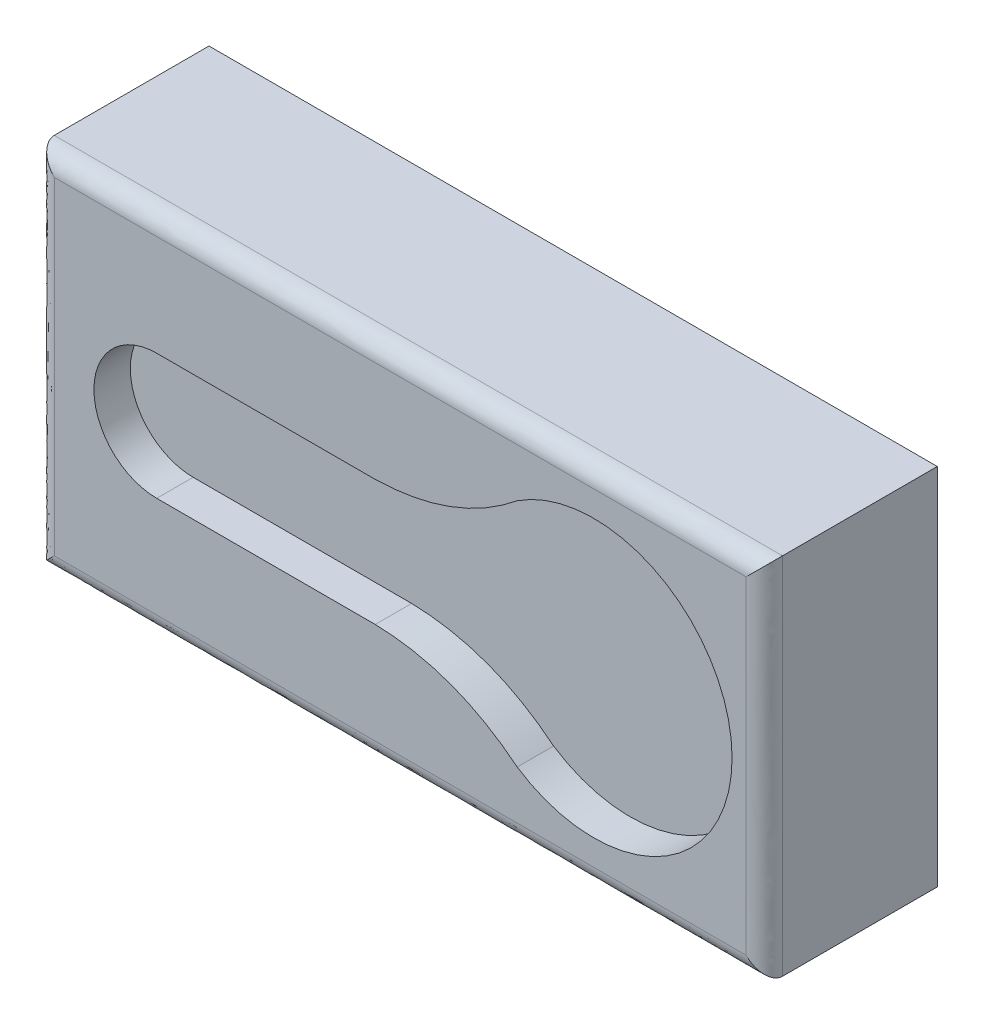
ISO-10303-21;
HEADER;
FILE_DESCRIPTION(('STEP AP214'),'2;1');
FILE_NAME('part.step','',(''),(''),'','','');
FILE_SCHEMA(('AUTOMOTIVE_DESIGN { 1 0 10303 214 1 1 1 1 }'));
ENDSEC;
DATA;
#1=APPLICATION_CONTEXT('core data for automotive mechanical design processes');
#2=APPLICATION_PROTOCOL_DEFINITION('international standard','automotive_design',2000,#1);
#3=PRODUCT_CONTEXT('',#1,'mechanical');
#4=PRODUCT('Part','Part','',(#3));
#5=PRODUCT_RELATED_PRODUCT_CATEGORY('part','',(#4));
#6=PRODUCT_DEFINITION_FORMATION('','',#4);
#7=PRODUCT_DEFINITION_CONTEXT('part definition',#1,'design');
#8=PRODUCT_DEFINITION('design','',#6,#7);
#9=PRODUCT_DEFINITION_SHAPE('','',#8);
#10=(LENGTH_UNIT() NAMED_UNIT(*) SI_UNIT(.MILLI.,.METRE.));
#11=(NAMED_UNIT(*) PLANE_ANGLE_UNIT() SI_UNIT($,.RADIAN.));
#12=(NAMED_UNIT(*) SI_UNIT($,.STERADIAN.) SOLID_ANGLE_UNIT());
#13=UNCERTAINTY_MEASURE_WITH_UNIT(LENGTH_MEASURE(1.E-05),#10,'distance_accuracy_value','');
#14=(GEOMETRIC_REPRESENTATION_CONTEXT(3) GLOBAL_UNCERTAINTY_ASSIGNED_CONTEXT((#13)) GLOBAL_UNIT_ASSIGNED_CONTEXT((#10,
#11,#12)) REPRESENTATION_CONTEXT('',''));
#15=CARTESIAN_POINT('',(0.,0.,0.));
#16=DIRECTION('',(0.,0.,1.));
#17=DIRECTION('',(1.,0.,0.));
#18=AXIS2_PLACEMENT_3D('',#15,#16,#17);
#19=CARTESIAN_POINT('',(-20.,9.99999999999999,-9.5));
#20=DIRECTION('',(1.,0.,0.));
#21=DIRECTION('',(0.,1.,0.));
#22=AXIS2_PLACEMENT_3D('',#19,#20,#21);
#23=PLANE('',#22);
#24=DIRECTION('',(0.,0.,1.));
#25=VECTOR('',#24,1.);
#26=CARTESIAN_POINT('',(-20.,9.99999999999999,-9.5));
#27=LINE('',#26,#25);
#28=CARTESIAN_POINT('',(-20.,9.99999999999999,-9.5));
#29=VERTEX_POINT('',#28);
#30=CARTESIAN_POINT('',(-20.,9.99999999999999,-0.999999999999999));
#31=VERTEX_POINT('',#30);
#32=EDGE_CURVE('E320',#29,#31,#27,.T.);
#33=ORIENTED_EDGE('',*,*,#32,.F.);
#34=DIRECTION('',(0.,-1.,0.));
#35=VECTOR('',#34,1.);
#36=CARTESIAN_POINT('',(-20.,9.99999999999999,-9.5));
#37=LINE('',#36,#35);
#38=CARTESIAN_POINT('',(-20.,-10.,-9.5));
#39=VERTEX_POINT('',#38);
#40=EDGE_CURVE('E302',#29,#39,#37,.T.);
#41=ORIENTED_EDGE('',*,*,#40,.T.);
#42=DIRECTION('',(0.,0.,1.));
#43=VECTOR('',#42,1.);
#44=CARTESIAN_POINT('',(-20.,-10.,-9.5));
#45=LINE('',#44,#43);
#46=CARTESIAN_POINT('',(-20.,-10.,-0.999999999999999));
#47=VERTEX_POINT('',#46);
#48=EDGE_CURVE('E329',#39,#47,#45,.T.);
#49=ORIENTED_EDGE('',*,*,#48,.T.);
#50=CARTESIAN_POINT('',(-20.,50.,-1.));
#51=CARTESIAN_POINT('',(-20.,36.6666666666667,-1.));
#52=CARTESIAN_POINT('',(-20.,23.3333333333333,-1.));
#53=CARTESIAN_POINT('',(-20.,10.,-1.));
#54=CARTESIAN_POINT('',(-20.,3.33333333333333,-1.));
#55=CARTESIAN_POINT('',(-20.,-3.33333333333334,-1.));
#56=CARTESIAN_POINT('',(-20.,-10.,-1.));
#57=CARTESIAN_POINT('',(-20.,-23.3333333333333,-1.));
#58=CARTESIAN_POINT('',(-20.,-36.6666666666667,-1.));
#59=CARTESIAN_POINT('',(-20.,-50.,-1.));
#60=(BOUNDED_CURVE() B_SPLINE_CURVE(3,(#50,#51,#52,#53,#54,#55,#56,#57,#58,#59),.UNSPECIFIED.,
.F.,.F.) B_SPLINE_CURVE_WITH_KNOTS((4,3,3,4),(-0.04,0.,0.02,0.06),
.UNSPECIFIED.) CURVE() GEOMETRIC_REPRESENTATION_ITEM() RATIONAL_B_SPLINE_CURVE((1.,1.,1.,1.,1.,
1.,1.,1.,1.,1.)) REPRESENTATION_ITEM(''));
#61=EDGE_CURVE('E332',#31,#47,#60,.T.);
#62=ORIENTED_EDGE('',*,*,#61,.F.);
#63=EDGE_LOOP('',(#33,#41,#49,#62));
#64=FACE_BOUND('',#63,.T.);
#65=ADVANCED_FACE('F38',(#64),#23,.F.);
#66=CARTESIAN_POINT('',(20.,-10.,-9.5));
#67=DIRECTION('',(0.,1.,0.));
#68=DIRECTION('',(-1.,0.,0.));
#69=AXIS2_PLACEMENT_3D('',#66,#67,#68);
#70=PLANE('',#69);
#71=ORIENTED_EDGE('',*,*,#48,.F.);
#72=DIRECTION('',(1.,0.,0.));
#73=VECTOR('',#72,1.);
#74=CARTESIAN_POINT('',(20.,-10.,-9.5));
#75=LINE('',#74,#73);
#76=CARTESIAN_POINT('',(20.,-10.,-9.5));
#77=VERTEX_POINT('',#76);
#78=EDGE_CURVE('E312',#39,#77,#75,.T.);
#79=ORIENTED_EDGE('',*,*,#78,.T.);
#80=DIRECTION('',(0.,0.,1.));
#81=VECTOR('',#80,1.);
#82=CARTESIAN_POINT('',(20.,-10.,-9.5));
#83=LINE('',#82,#81);
#84=CARTESIAN_POINT('',(20.,-10.,-0.999999999999999));
#85=VERTEX_POINT('',#84);
#86=EDGE_CURVE('E326',#77,#85,#83,.T.);
#87=ORIENTED_EDGE('',*,*,#86,.T.);
#88=CARTESIAN_POINT('',(-100.,-10.,-1.));
#89=CARTESIAN_POINT('',(-73.3333333333333,-10.,-1.));
#90=CARTESIAN_POINT('',(-46.6666666666667,-10.,-1.));
#91=CARTESIAN_POINT('',(-20.,-10.,-1.));
#92=CARTESIAN_POINT('',(-6.66666666666667,-10.,-1.));
#93=CARTESIAN_POINT('',(6.66666666666667,-10.,-1.));
#94=CARTESIAN_POINT('',(20.,-10.,-1.));
#95=CARTESIAN_POINT('',(46.6666666666667,-10.,-1.));
#96=CARTESIAN_POINT('',(73.3333333333334,-9.99999999999999,-1.));
#97=CARTESIAN_POINT('',(100.,-9.99999999999999,-1.));
#98=(BOUNDED_CURVE() B_SPLINE_CURVE(3,(#88,#89,#90,#91,#92,#93,#94,#95,#96,#97),.UNSPECIFIED.,
.F.,.F.) B_SPLINE_CURVE_WITH_KNOTS((4,3,3,4),(-0.12,-0.04,0.,0.08),
.UNSPECIFIED.) CURVE() GEOMETRIC_REPRESENTATION_ITEM() RATIONAL_B_SPLINE_CURVE((1.,1.,1.,1.,1.,
1.,1.,1.,1.,1.)) REPRESENTATION_ITEM(''));
#99=EDGE_CURVE('E367',#47,#85,#98,.T.);
#100=ORIENTED_EDGE('',*,*,#99,.F.);
#101=EDGE_LOOP('',(#71,#79,#87,#100));
#102=FACE_BOUND('',#101,.T.);
#103=ADVANCED_FACE('F194',(#102),#70,.F.);
#104=CARTESIAN_POINT('',(20.,10.,-9.5));
#105=DIRECTION('',(-1.,0.,0.));
#106=DIRECTION('',(0.,-1.,0.));
#107=AXIS2_PLACEMENT_3D('',#104,#105,#106);
#108=PLANE('',#107);
#109=ORIENTED_EDGE('',*,*,#86,.F.);
#110=DIRECTION('',(0.,1.,0.));
#111=VECTOR('',#110,1.);
#112=CARTESIAN_POINT('',(20.,10.,-9.5));
#113=LINE('',#112,#111);
#114=CARTESIAN_POINT('',(20.,10.,-9.5));
#115=VERTEX_POINT('',#114);
#116=EDGE_CURVE('E315',#77,#115,#113,.T.);
#117=ORIENTED_EDGE('',*,*,#116,.T.);
#118=DIRECTION('',(0.,0.,1.));
#119=VECTOR('',#118,1.);
#120=CARTESIAN_POINT('',(20.,10.,-9.5));
#121=LINE('',#120,#119);
#122=CARTESIAN_POINT('',(20.,10.,-0.999999999999999));
#123=VERTEX_POINT('',#122);
#124=EDGE_CURVE('E323',#115,#123,#121,.T.);
#125=ORIENTED_EDGE('',*,*,#124,.T.);
#126=CARTESIAN_POINT('',(20.,-50.,-1.));
#127=CARTESIAN_POINT('',(20.,-36.6666666666667,-1.));
#128=CARTESIAN_POINT('',(20.,-23.3333333333333,-1.));
#129=CARTESIAN_POINT('',(20.,-10.,-1.));
#130=CARTESIAN_POINT('',(20.,-3.33333333333334,-1.));
#131=CARTESIAN_POINT('',(20.,3.33333333333333,-1.));
#132=CARTESIAN_POINT('',(20.,10.,-1.));
#133=CARTESIAN_POINT('',(20.,23.3333333333333,-1.));
#134=CARTESIAN_POINT('',(20.,36.6666666666667,-1.));
#135=CARTESIAN_POINT('',(20.,50.,-1.));
#136=(BOUNDED_CURVE() B_SPLINE_CURVE(3,(#126,#127,#128,#129,#130,#131,#132,#133,#134,#135),
.UNSPECIFIED.,.F.,.F.) B_SPLINE_CURVE_WITH_KNOTS((4,3,3,4),(-0.06,-0.02,0.,0.04),
.UNSPECIFIED.) CURVE() GEOMETRIC_REPRESENTATION_ITEM() RATIONAL_B_SPLINE_CURVE((1.,1.,1.,1.,1.,
1.,1.,1.,1.,1.)) REPRESENTATION_ITEM(''));
#137=EDGE_CURVE('E12',#85,#123,#136,.T.);
#138=ORIENTED_EDGE('',*,*,#137,.F.);
#139=EDGE_LOOP('',(#109,#117,#125,#138));
#140=FACE_BOUND('',#139,.T.);
#141=ADVANCED_FACE('F190',(#140),#108,.F.);
#142=CARTESIAN_POINT('',(20.,10.,-9.5));
#143=DIRECTION('',(0.,-1.,0.));
#144=DIRECTION('',(1.,0.,0.));
#145=AXIS2_PLACEMENT_3D('',#142,#143,#144);
#146=PLANE('',#145);
#147=ORIENTED_EDGE('',*,*,#124,.F.);
#148=DIRECTION('',(-1.,0.,0.));
#149=VECTOR('',#148,1.);
#150=CARTESIAN_POINT('',(20.,10.,-9.5));
#151=LINE('',#150,#149);
#152=EDGE_CURVE('E318',#115,#29,#151,.T.);
#153=ORIENTED_EDGE('',*,*,#152,.T.);
#154=ORIENTED_EDGE('',*,*,#32,.T.);
#155=CARTESIAN_POINT('',(100.,10.,-1.));
#156=CARTESIAN_POINT('',(73.3333333333333,10.,-1.));
#157=CARTESIAN_POINT('',(46.6666666666667,10.,-1.));
#158=CARTESIAN_POINT('',(20.,10.,-1.));
#159=CARTESIAN_POINT('',(6.66666666666668,10.,-1.));
#160=CARTESIAN_POINT('',(-6.66666666666666,10.,-1.));
#161=CARTESIAN_POINT('',(-20.,10.,-1.));
#162=CARTESIAN_POINT('',(-46.6666666666667,9.99999999999999,-1.));
#163=CARTESIAN_POINT('',(-73.3333333333334,9.99999999999999,-1.));
#164=CARTESIAN_POINT('',(-100.,9.99999999999999,-1.));
#165=(BOUNDED_CURVE() B_SPLINE_CURVE(3,(#155,#156,#157,#158,#159,#160,#161,#162,#163,#164),
.UNSPECIFIED.,.F.,.F.) B_SPLINE_CURVE_WITH_KNOTS((4,3,3,4),(-0.08,0.,0.04,0.12),
.UNSPECIFIED.) CURVE() GEOMETRIC_REPRESENTATION_ITEM() RATIONAL_B_SPLINE_CURVE((1.,1.,1.,1.,1.,
1.,1.,1.,1.,1.)) REPRESENTATION_ITEM(''));
#166=EDGE_CURVE('E54',#123,#31,#165,.T.);
#167=ORIENTED_EDGE('',*,*,#166,.F.);
#168=EDGE_LOOP('',(#147,#153,#154,#167));
#169=FACE_BOUND('',#168,.T.);
#170=ADVANCED_FACE('F183',(#169),#146,.F.);
#171=CARTESIAN_POINT('',(0.,0.,-9.5));
#172=DIRECTION('',(0.,0.,1.));
#173=DIRECTION('',(-1.,0.,0.));
#174=AXIS2_PLACEMENT_3D('',#171,#172,#173);
#175=PLANE('',#174);
#176=ORIENTED_EDGE('',*,*,#40,.F.);
#177=ORIENTED_EDGE('',*,*,#152,.F.);
#178=ORIENTED_EDGE('',*,*,#116,.F.);
#179=ORIENTED_EDGE('',*,*,#78,.F.);
#180=EDGE_LOOP('',(#176,#177,#178,#179));
#181=FACE_BOUND('',#180,.T.);
#182=ADVANCED_FACE('F180',(#181),#175,.F.);
#183=CARTESIAN_POINT('',(0.,0.,0.));
#184=DIRECTION('',(0.,0.,1.));
#185=DIRECTION('',(-1.,0.,0.));
#186=AXIS2_PLACEMENT_3D('',#183,#184,#185);
#187=PLANE('',#186);
#188=CARTESIAN_POINT('',(-100.,-9.00000000000002,0.));
#189=CARTESIAN_POINT('',(-73.3333333333333,-9.00000000000002,0.));
#190=CARTESIAN_POINT('',(-46.6666666666667,-9.00000000000001,0.));
#191=CARTESIAN_POINT('',(-20.,-9.00000000000001,0.));
#192=CARTESIAN_POINT('',(-6.66666666666667,-9.00000000000001,0.));
#193=CARTESIAN_POINT('',(6.66666666666667,-9.00000000000001,0.));
#194=CARTESIAN_POINT('',(20.,-9.,0.));
#195=CARTESIAN_POINT('',(46.6666666666667,-9.,0.));
#196=CARTESIAN_POINT('',(73.3333333333334,-9.,0.));
#197=CARTESIAN_POINT('',(100.,-8.99999999999999,0.));
#198=(BOUNDED_CURVE() B_SPLINE_CURVE(3,(#188,#189,#190,#191,#192,#193,#194,#195,#196,#197),
.UNSPECIFIED.,.F.,.F.) B_SPLINE_CURVE_WITH_KNOTS((4,3,3,4),(-0.12,-0.04,0.,0.08),
.UNSPECIFIED.) CURVE() GEOMETRIC_REPRESENTATION_ITEM() RATIONAL_B_SPLINE_CURVE((1.,1.,1.,1.,1.,
1.,1.,1.,1.,1.)) REPRESENTATION_ITEM(''));
#199=CARTESIAN_POINT('',(19.,-9.,0.));
#200=VERTEX_POINT('',#199);
#201=CARTESIAN_POINT('',(-19.,-9.00000000000001,0.));
#202=VERTEX_POINT('',#201);
#203=EDGE_CURVE('E351',#200,#202,#198,.F.);
#204=ORIENTED_EDGE('',*,*,#203,.F.);
#205=CARTESIAN_POINT('',(19.,-50.,0.));
#206=CARTESIAN_POINT('',(19.,-36.6666666666667,0.));
#207=CARTESIAN_POINT('',(19.,-23.3333333333333,0.));
#208=CARTESIAN_POINT('',(19.,-10.,0.));
#209=CARTESIAN_POINT('',(19.,-3.33333333333334,0.));
#210=CARTESIAN_POINT('',(19.,3.33333333333333,0.));
#211=CARTESIAN_POINT('',(19.,10.,0.));
#212=CARTESIAN_POINT('',(19.,23.3333333333333,0.));
#213=CARTESIAN_POINT('',(19.,36.6666666666667,0.));
#214=CARTESIAN_POINT('',(19.,50.,0.));
#215=(BOUNDED_CURVE() B_SPLINE_CURVE(3,(#205,#206,#207,#208,#209,#210,#211,#212,#213,#214),
.UNSPECIFIED.,.F.,.F.) B_SPLINE_CURVE_WITH_KNOTS((4,3,3,4),(-0.06,-0.02,0.,0.04),
.UNSPECIFIED.) CURVE() GEOMETRIC_REPRESENTATION_ITEM() RATIONAL_B_SPLINE_CURVE((1.,1.,1.,1.,1.,
1.,1.,1.,1.,1.)) REPRESENTATION_ITEM(''));
#216=CARTESIAN_POINT('',(19.,9.,0.));
#217=VERTEX_POINT('',#216);
#218=EDGE_CURVE('E337',#217,#200,#215,.F.);
#219=ORIENTED_EDGE('',*,*,#218,.F.);
#220=CARTESIAN_POINT('',(100.,9.00000000000001,0.));
#221=CARTESIAN_POINT('',(73.3333333333333,9.00000000000001,0.));
#222=CARTESIAN_POINT('',(46.6666666666667,9.00000000000001,0.));
#223=CARTESIAN_POINT('',(20.,9.,0.));
#224=CARTESIAN_POINT('',(6.66666666666668,9.,0.));
#225=CARTESIAN_POINT('',(-6.66666666666666,9.,0.));
#226=CARTESIAN_POINT('',(-20.,9.,0.));
#227=CARTESIAN_POINT('',(-46.6666666666667,8.99999999999999,0.));
#228=CARTESIAN_POINT('',(-73.3333333333334,8.99999999999999,0.));
#229=CARTESIAN_POINT('',(-100.,8.99999999999999,0.));
#230=(BOUNDED_CURVE() B_SPLINE_CURVE(3,(#220,#221,#222,#223,#224,#225,#226,#227,#228,#229),
.UNSPECIFIED.,.F.,.F.) B_SPLINE_CURVE_WITH_KNOTS((4,3,3,4),(-0.08,0.,0.04,0.12),
.UNSPECIFIED.) CURVE() GEOMETRIC_REPRESENTATION_ITEM() RATIONAL_B_SPLINE_CURVE((1.,1.,1.,1.,1.,
1.,1.,1.,1.,1.)) REPRESENTATION_ITEM(''));
#231=CARTESIAN_POINT('',(-19.,9.,0.));
#232=VERTEX_POINT('',#231);
#233=EDGE_CURVE('E344',#232,#217,#230,.F.);
#234=ORIENTED_EDGE('',*,*,#233,.F.);
#235=CARTESIAN_POINT('',(-19.,50.,0.));
#236=CARTESIAN_POINT('',(-19.,36.6666666666667,0.));
#237=CARTESIAN_POINT('',(-19.,23.3333333333333,0.));
#238=CARTESIAN_POINT('',(-19.,10.,0.));
#239=CARTESIAN_POINT('',(-19.,3.33333333333333,0.));
#240=CARTESIAN_POINT('',(-19.,-3.33333333333334,0.));
#241=CARTESIAN_POINT('',(-19.,-10.,0.));
#242=CARTESIAN_POINT('',(-19.,-23.3333333333333,0.));
#243=CARTESIAN_POINT('',(-19.,-36.6666666666667,0.));
#244=CARTESIAN_POINT('',(-19.,-50.,0.));
#245=(BOUNDED_CURVE() B_SPLINE_CURVE(3,(#235,#236,#237,#238,#239,#240,#241,#242,#243,#244),
.UNSPECIFIED.,.F.,.F.) B_SPLINE_CURVE_WITH_KNOTS((4,3,3,4),(-0.04,0.,0.02,0.06),
.UNSPECIFIED.) CURVE() GEOMETRIC_REPRESENTATION_ITEM() RATIONAL_B_SPLINE_CURVE((1.,1.,1.,1.,1.,
1.,1.,1.,1.,1.)) REPRESENTATION_ITEM(''));
#246=EDGE_CURVE('E359',#202,#232,#245,.F.);
#247=ORIENTED_EDGE('',*,*,#246,.F.);
#248=EDGE_LOOP('',(#204,#219,#234,#247));
#249=FACE_BOUND('',#248,.T.);
#250=CARTESIAN_POINT('',(6.42660699078059,-6.33271135547255,0.));
#251=CARTESIAN_POINT('',(3.01282740585878,-3.5546753499692,0.));
#252=CARTESIAN_POINT('',(-1.37139742518204,-3.45000000000001,0.));
#253=B_SPLINE_CURVE_WITH_KNOTS('',2,(#250,#251,#252),.UNSPECIFIED.,.F.,.F.,(3,3),(0.,1.),.UNSPECIFIED.);
#254=CARTESIAN_POINT('',(6.4266069907806,-6.33271135547254,0.));
#255=VERTEX_POINT('',#254);
#256=CARTESIAN_POINT('',(-1.37139742518204,-3.45000000000001,0.));
#257=VERTEX_POINT('',#256);
#258=EDGE_CURVE('E280',#255,#257,#253,.T.);
#259=ORIENTED_EDGE('',*,*,#258,.T.);
#260=DIRECTION('',(-1.,0.,0.));
#261=VECTOR('',#260,1.);
#262=CARTESIAN_POINT('',(-13.3713974251821,-3.45000000000001,0.));
#263=LINE('',#262,#261);
#264=CARTESIAN_POINT('',(-13.3713974251821,-3.45000000000001,0.));
#265=VERTEX_POINT('',#264);
#266=EDGE_CURVE('E152',#257,#265,#263,.T.);
#267=ORIENTED_EDGE('',*,*,#266,.T.);
#268=CARTESIAN_POINT('',(-13.3713974251821,0.,0.));
#269=DIRECTION('',(0.,0.,-1.));
#270=DIRECTION('',(-1.,0.,0.));
#271=AXIS2_PLACEMENT_3D('',#268,#269,#270);
#272=CIRCLE('',#271,3.45);
#273=CARTESIAN_POINT('',(-13.3713974251821,3.44999999999999,0.));
#274=VERTEX_POINT('',#273);
#275=EDGE_CURVE('E288',#265,#274,#272,.T.);
#276=ORIENTED_EDGE('',*,*,#275,.T.);
#277=DIRECTION('',(1.,0.,0.));
#278=VECTOR('',#277,1.);
#279=CARTESIAN_POINT('',(-13.3713974251821,3.44999999999999,0.));
#280=LINE('',#279,#278);
#281=CARTESIAN_POINT('',(-1.37139742518204,3.45000000000001,0.));
#282=VERTEX_POINT('',#281);
#283=EDGE_CURVE('E291',#274,#282,#280,.T.);
#284=ORIENTED_EDGE('',*,*,#283,.T.);
#285=CARTESIAN_POINT('',(-1.37139742518204,3.45000000000001,0.));
#286=CARTESIAN_POINT('',(3.01282740585878,3.5546753499692,0.));
#287=CARTESIAN_POINT('',(6.42660699078059,6.33271135547255,0.));
#288=B_SPLINE_CURVE_WITH_KNOTS('',2,(#285,#286,#287),.UNSPECIFIED.,.F.,.F.,(3,3),(0.,1.),.UNSPECIFIED.);
#289=CARTESIAN_POINT('',(6.4266069907806,6.33271135547253,0.));
#290=VERTEX_POINT('',#289);
#291=EDGE_CURVE('E164',#282,#290,#288,.T.);
#292=ORIENTED_EDGE('',*,*,#291,.T.);
#293=CARTESIAN_POINT('',(10.6286025748179,0.,0.));
#294=DIRECTION('',(0.,0.,-1.));
#295=DIRECTION('',(-1.,0.,0.));
#296=AXIS2_PLACEMENT_3D('',#293,#294,#295);
#297=CIRCLE('',#296,7.59999999999999);
#298=EDGE_CURVE('E161',#290,#255,#297,.T.);
#299=ORIENTED_EDGE('',*,*,#298,.T.);
#300=EDGE_LOOP('',(#259,#267,#276,#284,#292,#299));
#301=FACE_BOUND('',#300,.T.);
#302=ADVANCED_FACE('F178',(#249,#301),#187,.T.);
#303=CARTESIAN_POINT('',(6.42660699078059,-6.33271135547255,-2.));
#304=CARTESIAN_POINT('',(3.01282740585878,-3.5546753499692,-2.));
#305=CARTESIAN_POINT('',(-1.37139742518204,-3.45000000000001,-2.));
#306=B_SPLINE_CURVE_WITH_KNOTS('',2,(#303,#304,#305),.UNSPECIFIED.,.F.,.F.,(3,3),(0.,1.),.UNSPECIFIED.);
#307=DIRECTION('',(0.,0.,1.));
#308=VECTOR('',#307,1.);
#309=SURFACE_OF_LINEAR_EXTRUSION('',#306,#308);
#310=ORIENTED_EDGE('',*,*,#258,.F.);
#311=DIRECTION('',(0.,0.,1.));
#312=VECTOR('',#311,1.);
#313=CARTESIAN_POINT('',(6.4266069907806,-6.33271135547254,-2.));
#314=LINE('',#313,#312);
#315=CARTESIAN_POINT('',(6.4266069907806,-6.33271135547254,-2.));
#316=VERTEX_POINT('',#315);
#317=EDGE_CURVE('E160',#316,#255,#314,.T.);
#318=ORIENTED_EDGE('',*,*,#317,.F.);
#319=CARTESIAN_POINT('',(-1.37139742518204,-3.45000000000001,-2.));
#320=VERTEX_POINT('',#319);
#321=EDGE_CURVE('E141',#316,#320,#306,.T.);
#322=ORIENTED_EDGE('',*,*,#321,.T.);
#323=DIRECTION('',(0.,0.,1.));
#324=VECTOR('',#323,1.);
#325=CARTESIAN_POINT('',(-1.37139742518204,-3.45000000000001,-2.));
#326=LINE('',#325,#324);
#327=EDGE_CURVE('E149',#320,#257,#326,.T.);
#328=ORIENTED_EDGE('',*,*,#327,.T.);
#329=EDGE_LOOP('',(#310,#318,#322,#328));
#330=FACE_BOUND('',#329,.T.);
#331=ADVANCED_FACE('F159',(#330),#309,.T.);
#332=CARTESIAN_POINT('',(10.6286025748179,0.,-2.));
#333=DIRECTION('',(0.,0.,1.));
#334=DIRECTION('',(-1.,0.,0.));
#335=AXIS2_PLACEMENT_3D('',#332,#333,#334);
#336=CYLINDRICAL_SURFACE('',#335,7.59999999999999);
#337=ORIENTED_EDGE('',*,*,#298,.F.);
#338=DIRECTION('',(0.,0.,1.));
#339=VECTOR('',#338,1.);
#340=CARTESIAN_POINT('',(6.4266069907806,6.33271135547253,-2.));
#341=LINE('',#340,#339);
#342=CARTESIAN_POINT('',(6.4266069907806,6.33271135547253,-2.));
#343=VERTEX_POINT('',#342);
#344=EDGE_CURVE('E303',#343,#290,#341,.T.);
#345=ORIENTED_EDGE('',*,*,#344,.F.);
#346=CARTESIAN_POINT('',(10.6286025748179,0.,-2.));
#347=DIRECTION('',(0.,0.,-1.));
#348=DIRECTION('',(-1.,0.,0.));
#349=AXIS2_PLACEMENT_3D('',#346,#347,#348);
#350=CIRCLE('',#349,7.59999999999999);
#351=EDGE_CURVE('E157',#343,#316,#350,.T.);
#352=ORIENTED_EDGE('',*,*,#351,.T.);
#353=ORIENTED_EDGE('',*,*,#317,.T.);
#354=EDGE_LOOP('',(#337,#345,#352,#353));
#355=FACE_BOUND('',#354,.T.);
#356=ADVANCED_FACE('F177',(#355),#336,.F.);
#357=CARTESIAN_POINT('',(-1.37139742518204,3.45000000000001,-2.));
#358=CARTESIAN_POINT('',(3.01282740585878,3.5546753499692,-2.));
#359=CARTESIAN_POINT('',(6.42660699078059,6.33271135547255,-2.));
#360=B_SPLINE_CURVE_WITH_KNOTS('',2,(#357,#358,#359),.UNSPECIFIED.,.F.,.F.,(3,3),(0.,1.),.UNSPECIFIED.);
#361=DIRECTION('',(0.,0.,1.));
#362=VECTOR('',#361,1.);
#363=SURFACE_OF_LINEAR_EXTRUSION('',#360,#362);
#364=ORIENTED_EDGE('',*,*,#291,.F.);
#365=DIRECTION('',(0.,0.,1.));
#366=VECTOR('',#365,1.);
#367=CARTESIAN_POINT('',(-1.37139742518204,3.45000000000001,-2.));
#368=LINE('',#367,#366);
#369=CARTESIAN_POINT('',(-1.37139742518204,3.45000000000001,-2.));
#370=VERTEX_POINT('',#369);
#371=EDGE_CURVE('E305',#370,#282,#368,.T.);
#372=ORIENTED_EDGE('',*,*,#371,.F.);
#373=EDGE_CURVE('E269',#370,#343,#360,.T.);
#374=ORIENTED_EDGE('',*,*,#373,.T.);
#375=ORIENTED_EDGE('',*,*,#344,.T.);
#376=EDGE_LOOP('',(#364,#372,#374,#375));
#377=FACE_BOUND('',#376,.T.);
#378=ADVANCED_FACE('F262',(#377),#363,.T.);
#379=CARTESIAN_POINT('',(-13.3713974251821,3.44999999999999,-2.));
#380=DIRECTION('',(0.,1.,0.));
#381=DIRECTION('',(0.,0.,-1.));
#382=AXIS2_PLACEMENT_3D('',#379,#380,#381);
#383=PLANE('',#382);
#384=ORIENTED_EDGE('',*,*,#283,.F.);
#385=DIRECTION('',(0.,0.,1.));
#386=VECTOR('',#385,1.);
#387=CARTESIAN_POINT('',(-13.3713974251821,3.44999999999999,-2.));
#388=LINE('',#387,#386);
#389=CARTESIAN_POINT('',(-13.3713974251821,3.44999999999999,-2.));
#390=VERTEX_POINT('',#389);
#391=EDGE_CURVE('E307',#390,#274,#388,.T.);
#392=ORIENTED_EDGE('',*,*,#391,.F.);
#393=DIRECTION('',(1.,0.,0.));
#394=VECTOR('',#393,1.);
#395=CARTESIAN_POINT('',(-13.3713974251821,3.44999999999999,-2.));
#396=LINE('',#395,#394);
#397=EDGE_CURVE('E275',#390,#370,#396,.T.);
#398=ORIENTED_EDGE('',*,*,#397,.T.);
#399=ORIENTED_EDGE('',*,*,#371,.T.);
#400=EDGE_LOOP('',(#384,#392,#398,#399));
#401=FACE_BOUND('',#400,.T.);
#402=ADVANCED_FACE('F267',(#401),#383,.F.);
#403=CARTESIAN_POINT('',(-13.3713974251821,0.,-2.));
#404=DIRECTION('',(0.,0.,1.));
#405=DIRECTION('',(-1.,0.,0.));
#406=AXIS2_PLACEMENT_3D('',#403,#404,#405);
#407=CYLINDRICAL_SURFACE('',#406,3.45);
#408=ORIENTED_EDGE('',*,*,#275,.F.);
#409=DIRECTION('',(0.,0.,1.));
#410=VECTOR('',#409,1.);
#411=CARTESIAN_POINT('',(-13.3713974251821,-3.45000000000001,-2.));
#412=LINE('',#411,#410);
#413=CARTESIAN_POINT('',(-13.3713974251821,-3.45000000000001,-2.));
#414=VERTEX_POINT('',#413);
#415=EDGE_CURVE('E156',#414,#265,#412,.T.);
#416=ORIENTED_EDGE('',*,*,#415,.F.);
#417=CARTESIAN_POINT('',(-13.3713974251821,0.,-2.));
#418=DIRECTION('',(0.,0.,-1.));
#419=DIRECTION('',(-1.,0.,0.));
#420=AXIS2_PLACEMENT_3D('',#417,#418,#419);
#421=CIRCLE('',#420,3.45);
#422=EDGE_CURVE('E144',#414,#390,#421,.T.);
#423=ORIENTED_EDGE('',*,*,#422,.T.);
#424=ORIENTED_EDGE('',*,*,#391,.T.);
#425=EDGE_LOOP('',(#408,#416,#423,#424));
#426=FACE_BOUND('',#425,.T.);
#427=ADVANCED_FACE('F258',(#426),#407,.F.);
#428=CARTESIAN_POINT('',(-13.3713974251821,-3.45000000000001,-2.));
#429=DIRECTION('',(0.,-1.,0.));
#430=DIRECTION('',(0.,0.,1.));
#431=AXIS2_PLACEMENT_3D('',#428,#429,#430);
#432=PLANE('',#431);
#433=ORIENTED_EDGE('',*,*,#266,.F.);
#434=ORIENTED_EDGE('',*,*,#327,.F.);
#435=DIRECTION('',(-1.,0.,0.));
#436=VECTOR('',#435,1.);
#437=CARTESIAN_POINT('',(-13.3713974251821,-3.45000000000001,-2.));
#438=LINE('',#437,#436);
#439=EDGE_CURVE('E136',#320,#414,#438,.T.);
#440=ORIENTED_EDGE('',*,*,#439,.T.);
#441=ORIENTED_EDGE('',*,*,#415,.T.);
#442=EDGE_LOOP('',(#433,#434,#440,#441));
#443=FACE_BOUND('',#442,.T.);
#444=ADVANCED_FACE('F150',(#443),#432,.F.);
#445=CARTESIAN_POINT('',(2.77021609432903,-4.22301551385274,-2.));
#446=DIRECTION('',(0.,0.,1.));
#447=DIRECTION('',(-1.,0.,0.));
#448=AXIS2_PLACEMENT_3D('',#445,#446,#447);
#449=PLANE('',#448);
#450=ORIENTED_EDGE('',*,*,#321,.F.);
#451=ORIENTED_EDGE('',*,*,#351,.F.);
#452=ORIENTED_EDGE('',*,*,#373,.F.);
#453=ORIENTED_EDGE('',*,*,#397,.F.);
#454=ORIENTED_EDGE('',*,*,#422,.F.);
#455=ORIENTED_EDGE('',*,*,#439,.F.);
#456=EDGE_LOOP('',(#450,#451,#452,#453,#454,#455));
#457=FACE_BOUND('',#456,.T.);
#458=ADVANCED_FACE('F138',(#457),#449,.T.);
#459=CARTESIAN_POINT('',(20.,-14.168,-1.));
#460=CARTESIAN_POINT('',(20.,-12.7786666666667,-1.));
#461=CARTESIAN_POINT('',(20.,-11.3893333333333,-1.));
#462=CARTESIAN_POINT('',(20.,-10.,-1.));
#463=CARTESIAN_POINT('',(20.,-3.33333333333334,-1.));
#464=CARTESIAN_POINT('',(20.,3.33333333333333,-1.));
#465=CARTESIAN_POINT('',(20.,10.,-1.));
#466=CARTESIAN_POINT('',(20.,11.3893333333333,-1.));
#467=CARTESIAN_POINT('',(20.,12.7786666666667,-1.));
#468=CARTESIAN_POINT('',(20.,14.168,-1.));
#469=CARTESIAN_POINT('',(20.,-14.168,0.));
#470=CARTESIAN_POINT('',(20.,-12.7786666666667,0.));
#471=CARTESIAN_POINT('',(20.,-11.3893333333333,0.));
#472=CARTESIAN_POINT('',(20.,-10.,0.));
#473=CARTESIAN_POINT('',(20.,-3.33333333333334,0.));
#474=CARTESIAN_POINT('',(20.,3.33333333333333,0.));
#475=CARTESIAN_POINT('',(20.,10.,0.));
#476=CARTESIAN_POINT('',(20.,11.3893333333333,0.));
#477=CARTESIAN_POINT('',(20.,12.7786666666667,0.));
#478=CARTESIAN_POINT('',(20.,14.168,0.));
#479=CARTESIAN_POINT('',(19.,-14.168,0.));
#480=CARTESIAN_POINT('',(19.,-12.7786666666667,0.));
#481=CARTESIAN_POINT('',(19.,-11.3893333333333,0.));
#482=CARTESIAN_POINT('',(19.,-10.,0.));
#483=CARTESIAN_POINT('',(19.,-3.33333333333334,0.));
#484=CARTESIAN_POINT('',(19.,3.33333333333333,0.));
#485=CARTESIAN_POINT('',(19.,10.,0.));
#486=CARTESIAN_POINT('',(19.,11.3893333333333,0.));
#487=CARTESIAN_POINT('',(19.,12.7786666666667,0.));
#488=CARTESIAN_POINT('',(19.,14.168,0.));
#489=(BOUNDED_SURFACE() B_SPLINE_SURFACE(2,3,((#459,#460,#461,#462,#463,#464,#465,#466,#467,
#468),(#469,#470,#471,#472,#473,#474,#475,#476,#477,#478),(#479,#480,#481,#482,#483,#484,#485,
#486,#487,#488)),.UNSPECIFIED.,.F.,.F.,.F.) B_SPLINE_SURFACE_WITH_KNOTS((3,3),(4,3,3,4),(0.,1.),
(-0.024168,-0.02,0.,0.00416799999999999),
.UNSPECIFIED.) GEOMETRIC_REPRESENTATION_ITEM() RATIONAL_B_SPLINE_SURFACE(((1.,1.,1.,1.,1.,1.,1.,
1.,1.,1.),(0.707106781186548,0.707106781186548,0.707106781186548,0.707106781186548,
0.707106781186548,0.707106781186548,0.707106781186548,0.707106781186548,0.707106781186548,
0.707106781186548),(1.,1.,1.,1.,1.,1.,1.,1.,1.,1.))) REPRESENTATION_ITEM('') SURFACE());
#490=CARTESIAN_POINT('',(20.,-10.,-1.));
#491=CARTESIAN_POINT('',(20.0000030280565,-10.0000030280565,-0.977567472566778));
#492=CARTESIAN_POINT('',(19.9992445090997,-9.99924450909966,-0.955148806119164));
#493=CARTESIAN_POINT('',(19.9962397778471,-9.99623977784712,-0.910528961228603));
#494=CARTESIAN_POINT('',(19.9939947299421,-9.99399472994211,-0.888327626352126));
#495=CARTESIAN_POINT('',(19.9851369433984,-9.98513694339842,-0.822695613271542));
#496=CARTESIAN_POINT('',(19.9764000530369,-9.97640005303693,-0.779808426642861));
#497=CARTESIAN_POINT('',(19.9539385439945,-9.95393854399451,-0.696939360315881));
#498=CARTESIAN_POINT('',(19.9402276443665,-9.9402276443665,-0.656949848905715));
#499=CARTESIAN_POINT('',(19.9086320129088,-9.90863201290882,-0.580345759346917));
#500=CARTESIAN_POINT('',(19.8907378534415,-9.89073785344154,-0.543739068851585));
#501=CARTESIAN_POINT('',(19.8436221180181,-9.8436221180181,-0.460138431002208));
#502=CARTESIAN_POINT('',(19.8127574566784,-9.8127574566784,-0.414998793200898));
#503=CARTESIAN_POINT('',(19.7463244925176,-9.74632449251764,-0.33229872253111));
#504=CARTESIAN_POINT('',(19.7107473091862,-9.71074730918616,-0.294752946089667));
#505=CARTESIAN_POINT('',(19.6219281670451,-9.62192816704506,-0.213819938450035));
#506=CARTESIAN_POINT('',(19.5671686578558,-9.56716865785585,-0.17377253655763));
#507=CARTESIAN_POINT('',(19.4538797107646,-9.45387971076462,-0.106500669760403));
#508=CARTESIAN_POINT('',(19.3953458545462,-9.39534585454619,-0.0792915551011685));
#509=CARTESIAN_POINT('',(19.281627641266,-9.28162764126604,-0.0387571830153362));
#510=CARTESIAN_POINT('',(19.2266237861857,-9.22662378618572,-0.024393095381267));
#511=CARTESIAN_POINT('',(19.1158878703527,-9.11588787035269,-0.00515371082379882));
#512=CARTESIAN_POINT('',(19.060157548571,-9.06015754857109,-0.000258874111870951));
#513=CARTESIAN_POINT('',(19.0029813888137,-9.00298138881367,-3.33747395311899E-06));
#514=CARTESIAN_POINT('',(19.0014906738579,-9.0014906738579,-4.56489470154058E-09));
#515=CARTESIAN_POINT('',(18.9999999999999,-8.99999999999994,0.));
#516=B_SPLINE_CURVE_WITH_KNOTS('',3,(#490,#491,#492,#493,#494,#495,#496,#497,#498,#499,#500,
#501,#502,#503,#504,#505,#506,#507,#508,#509,#510,#511,#512,#513,#514,#515),.UNSPECIFIED.,.F.,
.F.,(4,2,2,2,2,2,2,2,2,2,2,2,4),(0.,0.0672457396048317,0.134438868172214,0.26755982412951,
0.400316370108644,0.533375038354732,0.720712178250317,0.908407505989971,1.16855696340395,
1.42901668818516,1.66575363888482,1.90200155988639,1.90832612311249),.UNSPECIFIED.);
#517=EDGE_CURVE('E68',#200,#85,#516,.F.);
#518=CARTESIAN_POINT('',(20.,10.,-1.));
#519=CARTESIAN_POINT('',(20.0000030280565,10.0000030280565,-0.977567472566778));
#520=CARTESIAN_POINT('',(19.9992445090997,9.99924450909966,-0.955148806119166));
#521=CARTESIAN_POINT('',(19.9962397778471,9.99623977784712,-0.910528961228605));
#522=CARTESIAN_POINT('',(19.9939947299421,9.99399472994211,-0.888327626352128));
#523=CARTESIAN_POINT('',(19.9851369433984,9.98513694339842,-0.822695613271542));
#524=CARTESIAN_POINT('',(19.9764000530369,9.97640005303693,-0.779808426642861));
#525=CARTESIAN_POINT('',(19.9539385439945,9.95393854399451,-0.696939360315882));
#526=CARTESIAN_POINT('',(19.9402276443665,9.94022764436651,-0.65694984890572));
#527=CARTESIAN_POINT('',(19.9086320129088,9.90863201290882,-0.580345759346924));
#528=CARTESIAN_POINT('',(19.8907378534415,9.89073785344154,-0.543739068851592));
#529=CARTESIAN_POINT('',(19.8436221180181,9.84362211801811,-0.460138431002214));
#530=CARTESIAN_POINT('',(19.8127574566784,9.8127574566784,-0.414998793200905));
#531=CARTESIAN_POINT('',(19.7463244925176,9.74632449251765,-0.332298722531118));
#532=CARTESIAN_POINT('',(19.7107473091862,9.71074730918617,-0.294752946089675));
#533=CARTESIAN_POINT('',(19.6219281670451,9.62192816704507,-0.213819938450042));
#534=CARTESIAN_POINT('',(19.5671686578559,9.56716865785586,-0.173772536557635));
#535=CARTESIAN_POINT('',(19.4538797107646,9.45387971076463,-0.106500669760407));
#536=CARTESIAN_POINT('',(19.3953458545462,9.3953458545462,-0.0792915551011721));
#537=CARTESIAN_POINT('',(19.281627641266,9.28162764126605,-0.0387571830153387));
#538=CARTESIAN_POINT('',(19.2266237861857,9.22662378618574,-0.0243930953812686));
#539=CARTESIAN_POINT('',(19.1158878703527,9.11588787035268,-0.0051537108237991));
#540=CARTESIAN_POINT('',(19.0601575485711,9.06015754857106,-0.000258874111871048));
#541=CARTESIAN_POINT('',(19.0029813888137,9.00298138881368,-3.33747395311332E-06));
#542=CARTESIAN_POINT('',(19.0014906738579,9.0014906738579,-4.5648946935281E-09));
#543=CARTESIAN_POINT('',(18.9999999999999,8.99999999999994,0.));
#544=B_SPLINE_CURVE_WITH_KNOTS('',3,(#518,#519,#520,#521,#522,#523,#524,#525,#526,#527,#528,
#529,#530,#531,#532,#533,#534,#535,#536,#537,#538,#539,#540,#541,#542,#543),.UNSPECIFIED.,.F.,
.F.,(4,2,2,2,2,2,2,2,2,2,2,2,4),(0.,0.0672457396048301,0.134438868172213,0.267559824129506,
0.400316370108638,0.533375038354724,0.720712178250308,0.908407505989957,1.16855696340393,
1.42901668818516,1.66575363888481,1.90200155988638,1.90832612311249),.UNSPECIFIED.);
#545=EDGE_CURVE('E45',#123,#217,#544,.T.);
#546=ORIENTED_EDGE('',*,*,#517,.T.);
#547=ORIENTED_EDGE('',*,*,#137,.T.);
#548=ORIENTED_EDGE('',*,*,#545,.T.);
#549=ORIENTED_EDGE('',*,*,#218,.T.);
#550=EDGE_LOOP('',(#546,#547,#548,#549));
#551=FACE_BOUND('',#550,.T.);
#552=ADVANCED_FACE('F40',(#551),#489,.F.);
#553=CARTESIAN_POINT('',(28.336,10.,-1.));
#554=CARTESIAN_POINT('',(25.5573333333333,10.,-1.));
#555=CARTESIAN_POINT('',(22.7786666666667,10.,-1.));
#556=CARTESIAN_POINT('',(20.,10.,-1.));
#557=CARTESIAN_POINT('',(6.66666666666668,10.,-1.));
#558=CARTESIAN_POINT('',(-6.66666666666666,10.,-1.));
#559=CARTESIAN_POINT('',(-20.,10.,-1.));
#560=CARTESIAN_POINT('',(-22.7786666666667,10.,-1.));
#561=CARTESIAN_POINT('',(-25.5573333333333,10.,-1.));
#562=CARTESIAN_POINT('',(-28.336,10.,-1.));
#563=CARTESIAN_POINT('',(28.336,10.,0.));
#564=CARTESIAN_POINT('',(25.5573333333333,10.,0.));
#565=CARTESIAN_POINT('',(22.7786666666667,10.,0.));
#566=CARTESIAN_POINT('',(20.,10.,0.));
#567=CARTESIAN_POINT('',(6.66666666666668,10.,0.));
#568=CARTESIAN_POINT('',(-6.66666666666666,10.,0.));
#569=CARTESIAN_POINT('',(-20.,10.,0.));
#570=CARTESIAN_POINT('',(-22.7786666666667,9.99999999999999,0.));
#571=CARTESIAN_POINT('',(-25.5573333333333,9.99999999999999,0.));
#572=CARTESIAN_POINT('',(-28.336,9.99999999999999,0.));
#573=CARTESIAN_POINT('',(28.336,9.,0.));
#574=CARTESIAN_POINT('',(25.5573333333333,9.,0.));
#575=CARTESIAN_POINT('',(22.7786666666667,9.,0.));
#576=CARTESIAN_POINT('',(20.,9.,0.));
#577=CARTESIAN_POINT('',(6.66666666666668,9.,0.));
#578=CARTESIAN_POINT('',(-6.66666666666666,9.,0.));
#579=CARTESIAN_POINT('',(-20.,9.,0.));
#580=CARTESIAN_POINT('',(-22.7786666666667,9.,0.));
#581=CARTESIAN_POINT('',(-25.5573333333333,9.,0.));
#582=CARTESIAN_POINT('',(-28.336,8.99999999999999,0.));
#583=(BOUNDED_SURFACE() B_SPLINE_SURFACE(2,3,((#553,#554,#555,#556,#557,#558,#559,#560,#561,
#562),(#563,#564,#565,#566,#567,#568,#569,#570,#571,#572),(#573,#574,#575,#576,#577,#578,#579,
#580,#581,#582)),.UNSPECIFIED.,.F.,.F.,.F.) B_SPLINE_SURFACE_WITH_KNOTS((3,3),(4,3,3,4),(0.,1.),
(-0.00833599999999997,0.,0.04,0.048336),
.UNSPECIFIED.) GEOMETRIC_REPRESENTATION_ITEM() RATIONAL_B_SPLINE_SURFACE(((1.,1.,1.,1.,1.,1.,1.,
1.,1.,1.),(0.707106781186548,0.707106781186548,0.707106781186548,0.707106781186548,
0.707106781186548,0.707106781186548,0.707106781186548,0.707106781186548,0.707106781186548,
0.707106781186548),(1.,1.,1.,1.,1.,1.,1.,1.,1.,1.))) REPRESENTATION_ITEM('') SURFACE());
#584=CARTESIAN_POINT('',(-20.,10.,-1.));
#585=CARTESIAN_POINT('',(-20.0000030280565,10.0000030280565,-0.977567472566778));
#586=CARTESIAN_POINT('',(-19.9992445090997,9.99924450909965,-0.955148806119164));
#587=CARTESIAN_POINT('',(-19.9962397778471,9.99623977784711,-0.910528961228602));
#588=CARTESIAN_POINT('',(-19.9939947299421,9.9939947299421,-0.888327626352125));
#589=CARTESIAN_POINT('',(-19.9851369433984,9.98513694339842,-0.82269561327154));
#590=CARTESIAN_POINT('',(-19.9764000530369,9.97640005303693,-0.77980842664286));
#591=CARTESIAN_POINT('',(-19.9539385439945,9.9539385439945,-0.696939360315882));
#592=CARTESIAN_POINT('',(-19.9402276443665,9.9402276443665,-0.656949848905719));
#593=CARTESIAN_POINT('',(-19.9086320129088,9.90863201290881,-0.580345759346921));
#594=CARTESIAN_POINT('',(-19.8907378534415,9.89073785344154,-0.543739068851587));
#595=CARTESIAN_POINT('',(-19.8436221180181,9.8436221180181,-0.460138431002209));
#596=CARTESIAN_POINT('',(-19.8127574566784,9.81275745667839,-0.414998793200904));
#597=CARTESIAN_POINT('',(-19.7463244925176,9.74632449251764,-0.332298722531117));
#598=CARTESIAN_POINT('',(-19.7107473091862,9.71074730918616,-0.294752946089671));
#599=CARTESIAN_POINT('',(-19.6219281670451,9.62192816704507,-0.213819938450036));
#600=CARTESIAN_POINT('',(-19.5671686578559,9.56716865785585,-0.173772536557635));
#601=CARTESIAN_POINT('',(-19.4538797107646,9.45387971076463,-0.106500669760409));
#602=CARTESIAN_POINT('',(-19.3953458545462,9.39534585454619,-0.0792915551011719));
#603=CARTESIAN_POINT('',(-19.2816276412661,9.28162764126604,-0.0387571830153372));
#604=CARTESIAN_POINT('',(-19.2266237861857,9.22662378618572,-0.0243930953812681));
#605=CARTESIAN_POINT('',(-19.1158878703527,9.11588787035268,-0.00515371082379938));
#606=CARTESIAN_POINT('',(-19.060157548571,9.06015754857107,-0.000258874111871001));
#607=CARTESIAN_POINT('',(-19.0029813888137,9.00298138881367,-3.33747395311812E-06));
#608=CARTESIAN_POINT('',(-19.0014906738579,9.00149067385789,-4.56489469972935E-09));
#609=CARTESIAN_POINT('',(-18.9999999999999,8.99999999999993,0.));
#610=B_SPLINE_CURVE_WITH_KNOTS('',3,(#584,#585,#586,#587,#588,#589,#590,#591,#592,#593,#594,
#595,#596,#597,#598,#599,#600,#601,#602,#603,#604,#605,#606,#607,#608,#609),.UNSPECIFIED.,.F.,
.F.,(4,2,2,2,2,2,2,2,2,2,2,2,4),(0.,0.0672457396048319,0.134438868172214,0.267559824129509,
0.400316370108644,0.533375038354731,0.720712178250312,0.90840750598996,1.16855696340393,
1.42901668818515,1.66575363888481,1.90200155988639,1.90832612311249),.UNSPECIFIED.);
#611=EDGE_CURVE('E226',#31,#232,#610,.T.);
#612=ORIENTED_EDGE('',*,*,#545,.F.);
#613=ORIENTED_EDGE('',*,*,#166,.T.);
#614=ORIENTED_EDGE('',*,*,#611,.T.);
#615=ORIENTED_EDGE('',*,*,#233,.T.);
#616=EDGE_LOOP('',(#612,#613,#614,#615));
#617=FACE_BOUND('',#616,.T.);
#618=ADVANCED_FACE('F235',(#617),#583,.F.);
#619=CARTESIAN_POINT('',(-28.336,-10.,-1.));
#620=CARTESIAN_POINT('',(-25.5573333333333,-10.,-1.));
#621=CARTESIAN_POINT('',(-22.7786666666667,-10.,-1.));
#622=CARTESIAN_POINT('',(-20.,-10.,-1.));
#623=CARTESIAN_POINT('',(-6.66666666666667,-10.,-1.));
#624=CARTESIAN_POINT('',(6.66666666666667,-10.,-1.));
#625=CARTESIAN_POINT('',(20.,-10.,-1.));
#626=CARTESIAN_POINT('',(22.7786666666667,-10.,-1.));
#627=CARTESIAN_POINT('',(25.5573333333333,-10.,-1.));
#628=CARTESIAN_POINT('',(28.336,-10.,-1.));
#629=CARTESIAN_POINT('',(-28.336,-10.,0.));
#630=CARTESIAN_POINT('',(-25.5573333333333,-10.,0.));
#631=CARTESIAN_POINT('',(-22.7786666666667,-10.,0.));
#632=CARTESIAN_POINT('',(-20.,-10.,0.));
#633=CARTESIAN_POINT('',(-6.66666666666667,-10.,0.));
#634=CARTESIAN_POINT('',(6.66666666666667,-10.,0.));
#635=CARTESIAN_POINT('',(20.,-10.,0.));
#636=CARTESIAN_POINT('',(22.7786666666667,-10.,0.));
#637=CARTESIAN_POINT('',(25.5573333333333,-10.,0.));
#638=CARTESIAN_POINT('',(28.336,-10.,0.));
#639=CARTESIAN_POINT('',(-28.336,-9.00000000000001,0.));
#640=CARTESIAN_POINT('',(-25.5573333333333,-9.00000000000001,0.));
#641=CARTESIAN_POINT('',(-22.7786666666667,-9.00000000000001,0.));
#642=CARTESIAN_POINT('',(-20.,-9.00000000000001,0.));
#643=CARTESIAN_POINT('',(-6.66666666666667,-9.00000000000001,0.));
#644=CARTESIAN_POINT('',(6.66666666666667,-9.00000000000001,0.));
#645=CARTESIAN_POINT('',(20.,-9.,0.));
#646=CARTESIAN_POINT('',(22.7786666666667,-9.,0.));
#647=CARTESIAN_POINT('',(25.5573333333333,-9.,0.));
#648=CARTESIAN_POINT('',(28.336,-9.,0.));
#649=(BOUNDED_SURFACE() B_SPLINE_SURFACE(2,3,((#619,#620,#621,#622,#623,#624,#625,#626,#627,
#628),(#629,#630,#631,#632,#633,#634,#635,#636,#637,#638),(#639,#640,#641,#642,#643,#644,#645,
#646,#647,#648)),.UNSPECIFIED.,.F.,.F.,.F.) B_SPLINE_SURFACE_WITH_KNOTS((3,3),(4,3,3,4),(0.,1.),
(-0.048336,-0.04,0.,0.00833599999999999),
.UNSPECIFIED.) GEOMETRIC_REPRESENTATION_ITEM() RATIONAL_B_SPLINE_SURFACE(((1.,1.,1.,1.,1.,1.,1.,
1.,1.,1.),(0.707106781186548,0.707106781186548,0.707106781186548,0.707106781186548,
0.707106781186548,0.707106781186548,0.707106781186548,0.707106781186548,0.707106781186548,
0.707106781186548),(1.,1.,1.,1.,1.,1.,1.,1.,1.,1.))) REPRESENTATION_ITEM('') SURFACE());
#650=CARTESIAN_POINT('',(-20.,-10.,-1.));
#651=CARTESIAN_POINT('',(-20.0000030280565,-10.0000030280565,-0.977567472566778));
#652=CARTESIAN_POINT('',(-19.9992445090997,-9.99924450909967,-0.955148806119165));
#653=CARTESIAN_POINT('',(-19.9962397778471,-9.99623977784713,-0.910528961228604));
#654=CARTESIAN_POINT('',(-19.9939947299421,-9.99399472994211,-0.888327626352127));
#655=CARTESIAN_POINT('',(-19.9851369433984,-9.98513694339843,-0.822695613271542));
#656=CARTESIAN_POINT('',(-19.9764000530369,-9.97640005303694,-0.779808426642861));
#657=CARTESIAN_POINT('',(-19.9539385439945,-9.95393854399451,-0.696939360315883));
#658=CARTESIAN_POINT('',(-19.9402276443665,-9.94022764436651,-0.656949848905719));
#659=CARTESIAN_POINT('',(-19.9086320129088,-9.90863201290882,-0.58034575934692));
#660=CARTESIAN_POINT('',(-19.8907378534416,-9.89073785344155,-0.543739068851586));
#661=CARTESIAN_POINT('',(-19.8436221180181,-9.84362211801811,-0.460138431002206));
#662=CARTESIAN_POINT('',(-19.8127574566784,-9.8127574566784,-0.4149987932009));
#663=CARTESIAN_POINT('',(-19.7463244925176,-9.74632449251765,-0.332298722531114));
#664=CARTESIAN_POINT('',(-19.7107473091862,-9.71074730918617,-0.29475294608967));
#665=CARTESIAN_POINT('',(-19.6219281670451,-9.62192816704507,-0.213819938450036));
#666=CARTESIAN_POINT('',(-19.5671686578559,-9.56716865785585,-0.173772536557631));
#667=CARTESIAN_POINT('',(-19.4538797107646,-9.45387971076463,-0.106500669760403));
#668=CARTESIAN_POINT('',(-19.3953458545462,-9.3953458545462,-0.0792915551011685));
#669=CARTESIAN_POINT('',(-19.281627641266,-9.28162764126605,-0.0387571830153361));
#670=CARTESIAN_POINT('',(-19.2266237861857,-9.22662378618573,-0.0243930953812668));
#671=CARTESIAN_POINT('',(-19.1158878703527,-9.11588787035269,-0.00515371082379868));
#672=CARTESIAN_POINT('',(-19.060157548571,-9.06015754857107,-0.000258874111871163));
#673=CARTESIAN_POINT('',(-19.0029813888137,-9.00298138881368,-3.33747395312422E-06));
#674=CARTESIAN_POINT('',(-19.0014906738579,-9.0014906738579,-4.56489470114866E-09));
#675=CARTESIAN_POINT('',(-18.9999999999999,-8.99999999999994,0.));
#676=B_SPLINE_CURVE_WITH_KNOTS('',3,(#650,#651,#652,#653,#654,#655,#656,#657,#658,#659,#660,
#661,#662,#663,#664,#665,#666,#667,#668,#669,#670,#671,#672,#673,#674,#675),.UNSPECIFIED.,.F.,
.F.,(4,2,2,2,2,2,2,2,2,2,2,2,4),(0.,0.0672457396048311,0.134438868172213,0.267559824129509,
0.40031637010864,0.533375038354726,0.720712178250317,0.908407505989973,1.16855696340394,
1.42901668818516,1.66575363888482,1.90200155988639,1.90832612311249),.UNSPECIFIED.);
#677=EDGE_CURVE('E220',#202,#47,#676,.F.);
#678=ORIENTED_EDGE('',*,*,#517,.F.);
#679=ORIENTED_EDGE('',*,*,#203,.T.);
#680=ORIENTED_EDGE('',*,*,#677,.T.);
#681=ORIENTED_EDGE('',*,*,#99,.T.);
#682=EDGE_LOOP('',(#678,#679,#680,#681));
#683=FACE_BOUND('',#682,.T.);
#684=ADVANCED_FACE('F208',(#683),#649,.F.);
#685=CARTESIAN_POINT('',(-20.,14.168,-1.));
#686=CARTESIAN_POINT('',(-20.,12.7786666666667,-1.));
#687=CARTESIAN_POINT('',(-20.,11.3893333333333,-1.));
#688=CARTESIAN_POINT('',(-20.,10.,-1.));
#689=CARTESIAN_POINT('',(-20.,3.33333333333333,-1.));
#690=CARTESIAN_POINT('',(-20.,-3.33333333333334,-1.));
#691=CARTESIAN_POINT('',(-20.,-10.,-1.));
#692=CARTESIAN_POINT('',(-20.,-11.3893333333333,-1.));
#693=CARTESIAN_POINT('',(-20.,-12.7786666666667,-1.));
#694=CARTESIAN_POINT('',(-20.,-14.168,-1.));
#695=CARTESIAN_POINT('',(-20.,14.168,0.));
#696=CARTESIAN_POINT('',(-20.,12.7786666666667,0.));
#697=CARTESIAN_POINT('',(-20.,11.3893333333333,0.));
#698=CARTESIAN_POINT('',(-20.,10.,0.));
#699=CARTESIAN_POINT('',(-20.,3.33333333333333,0.));
#700=CARTESIAN_POINT('',(-20.,-3.33333333333334,0.));
#701=CARTESIAN_POINT('',(-20.,-10.,0.));
#702=CARTESIAN_POINT('',(-20.,-11.3893333333333,0.));
#703=CARTESIAN_POINT('',(-20.,-12.7786666666667,0.));
#704=CARTESIAN_POINT('',(-20.,-14.168,0.));
#705=CARTESIAN_POINT('',(-19.,14.168,0.));
#706=CARTESIAN_POINT('',(-19.,12.7786666666667,0.));
#707=CARTESIAN_POINT('',(-19.,11.3893333333333,0.));
#708=CARTESIAN_POINT('',(-19.,10.,0.));
#709=CARTESIAN_POINT('',(-19.,3.33333333333333,0.));
#710=CARTESIAN_POINT('',(-19.,-3.33333333333334,0.));
#711=CARTESIAN_POINT('',(-19.,-10.,0.));
#712=CARTESIAN_POINT('',(-19.,-11.3893333333333,0.));
#713=CARTESIAN_POINT('',(-19.,-12.7786666666667,0.));
#714=CARTESIAN_POINT('',(-19.,-14.168,0.));
#715=(BOUNDED_SURFACE() B_SPLINE_SURFACE(2,3,((#685,#686,#687,#688,#689,#690,#691,#692,#693,
#694),(#695,#696,#697,#698,#699,#700,#701,#702,#703,#704),(#705,#706,#707,#708,#709,#710,#711,
#712,#713,#714)),.UNSPECIFIED.,.F.,.F.,.F.) B_SPLINE_SURFACE_WITH_KNOTS((3,3),(4,3,3,4),(0.,1.),
(-0.004168,0.,0.02,0.024168),
.UNSPECIFIED.) GEOMETRIC_REPRESENTATION_ITEM() RATIONAL_B_SPLINE_SURFACE(((1.,1.,1.,1.,1.,1.,1.,
1.,1.,1.),(0.707106781186548,0.707106781186548,0.707106781186548,0.707106781186548,
0.707106781186548,0.707106781186548,0.707106781186548,0.707106781186548,0.707106781186548,
0.707106781186548),(1.,1.,1.,1.,1.,1.,1.,1.,1.,1.))) REPRESENTATION_ITEM('') SURFACE());
#716=ORIENTED_EDGE('',*,*,#611,.F.);
#717=ORIENTED_EDGE('',*,*,#61,.T.);
#718=ORIENTED_EDGE('',*,*,#677,.F.);
#719=ORIENTED_EDGE('',*,*,#246,.T.);
#720=EDGE_LOOP('',(#716,#717,#718,#719));
#721=FACE_BOUND('',#720,.T.);
#722=ADVANCED_FACE('F202',(#721),#715,.F.);
#723=CLOSED_SHELL('',(#65,#103,#141,#170,#182,#302,#331,#356,#378,#402,#427,#444,#458,#552,#618,
#684,#722));
#724=MANIFOLD_SOLID_BREP('B2',#723);
#725=ADVANCED_BREP_SHAPE_REPRESENTATION('',(#18,#724),#14);
#726=SHAPE_DEFINITION_REPRESENTATION(#9,#725);
ENDSEC;
END-ISO-10303-21;
